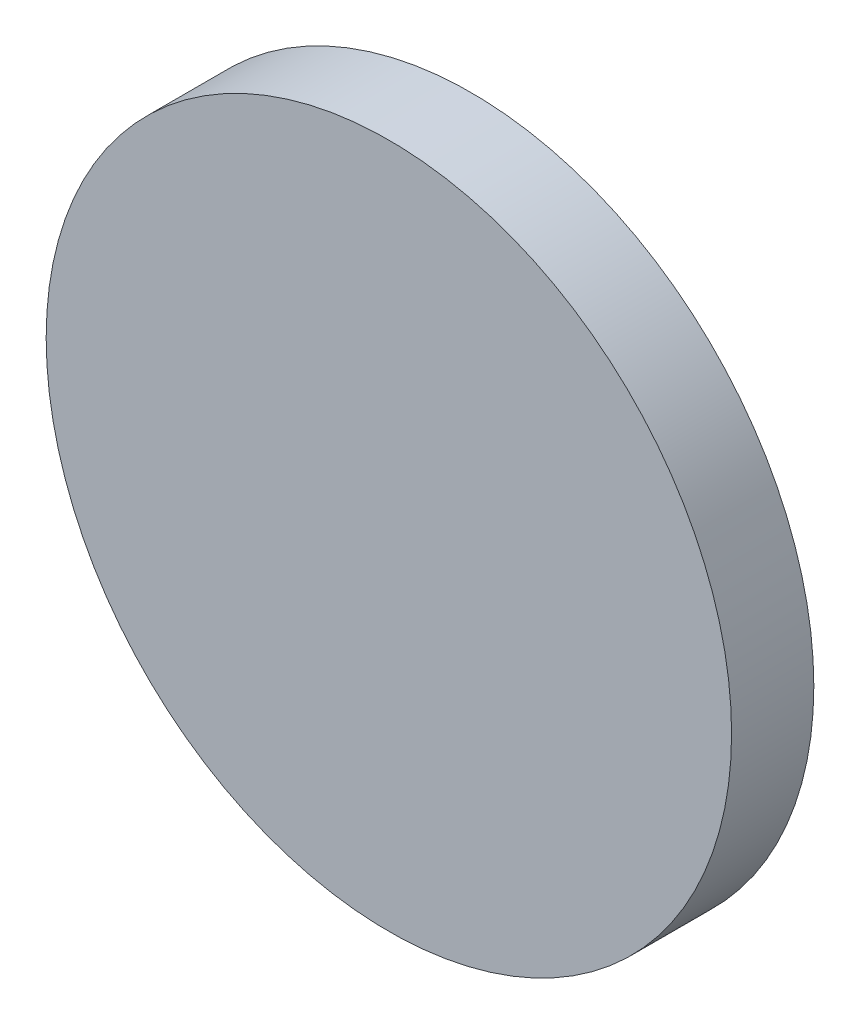
ISO-10303-21;
HEADER;
FILE_DESCRIPTION(('STEP AP214'),'2;1');
FILE_NAME('part.step','',(''),(''),'','','');
FILE_SCHEMA(('AUTOMOTIVE_DESIGN { 1 0 10303 214 1 1 1 1 }'));
ENDSEC;
DATA;
#1=APPLICATION_CONTEXT('core data for automotive mechanical design processes');
#2=APPLICATION_PROTOCOL_DEFINITION('international standard','automotive_design',2000,#1);
#3=PRODUCT_CONTEXT('',#1,'mechanical');
#4=PRODUCT('Part','Part','',(#3));
#5=PRODUCT_RELATED_PRODUCT_CATEGORY('part','',(#4));
#6=PRODUCT_DEFINITION_FORMATION('','',#4);
#7=PRODUCT_DEFINITION_CONTEXT('part definition',#1,'design');
#8=PRODUCT_DEFINITION('design','',#6,#7);
#9=PRODUCT_DEFINITION_SHAPE('','',#8);
#10=(LENGTH_UNIT() NAMED_UNIT(*) SI_UNIT(.MILLI.,.METRE.));
#11=(NAMED_UNIT(*) PLANE_ANGLE_UNIT() SI_UNIT($,.RADIAN.));
#12=(NAMED_UNIT(*) SI_UNIT($,.STERADIAN.) SOLID_ANGLE_UNIT());
#13=UNCERTAINTY_MEASURE_WITH_UNIT(LENGTH_MEASURE(1.E-05),#10,'distance_accuracy_value','');
#14=(GEOMETRIC_REPRESENTATION_CONTEXT(3) GLOBAL_UNCERTAINTY_ASSIGNED_CONTEXT((#13)) GLOBAL_UNIT_ASSIGNED_CONTEXT((#10,
#11,#12)) REPRESENTATION_CONTEXT('',''));
#15=CARTESIAN_POINT('',(0.,0.,0.));
#16=DIRECTION('',(0.,0.,1.));
#17=DIRECTION('',(1.,0.,0.));
#18=AXIS2_PLACEMENT_3D('',#15,#16,#17);
#19=CARTESIAN_POINT('',(0.,0.,1.5));
#20=DIRECTION('',(0.,0.,-1.));
#21=DIRECTION('',(-1.,0.,0.));
#22=AXIS2_PLACEMENT_3D('',#19,#20,#21);
#23=CYLINDRICAL_SURFACE('',#22,6.25);
#24=CARTESIAN_POINT('',(0.,0.,1.5));
#25=DIRECTION('',(0.,0.,1.));
#26=DIRECTION('',(1.,0.,0.));
#27=AXIS2_PLACEMENT_3D('',#24,#25,#26);
#28=CIRCLE('',#27,6.25);
#29=CARTESIAN_POINT('',(6.25,0.,1.5));
#30=VERTEX_POINT('',#29);
#31=EDGE_CURVE('E10',#30,#30,#28,.T.);
#32=ORIENTED_EDGE('',*,*,#31,.F.);
#33=EDGE_LOOP('',(#32));
#34=FACE_BOUND('',#33,.T.);
#35=CARTESIAN_POINT('',(0.,0.,0.));
#36=DIRECTION('',(0.,0.,1.));
#37=DIRECTION('',(1.,0.,0.));
#38=AXIS2_PLACEMENT_3D('',#35,#36,#37);
#39=CIRCLE('',#38,6.25);
#40=CARTESIAN_POINT('',(6.25,0.,0.));
#41=VERTEX_POINT('',#40);
#42=EDGE_CURVE('E36',#41,#41,#39,.T.);
#43=ORIENTED_EDGE('',*,*,#42,.T.);
#44=EDGE_LOOP('',(#43));
#45=FACE_BOUND('',#44,.T.);
#46=ADVANCED_FACE('F33',(#34,#45),#23,.T.);
#47=CARTESIAN_POINT('',(0.,0.,1.5));
#48=DIRECTION('',(0.,0.,1.));
#49=DIRECTION('',(1.,0.,0.));
#50=AXIS2_PLACEMENT_3D('',#47,#48,#49);
#51=PLANE('',#50);
#52=ORIENTED_EDGE('',*,*,#31,.T.);
#53=EDGE_LOOP('',(#52));
#54=FACE_BOUND('',#53,.T.);
#55=ADVANCED_FACE('F48',(#54),#51,.T.);
#56=CARTESIAN_POINT('',(0.,0.,0.));
#57=DIRECTION('',(0.,0.,1.));
#58=DIRECTION('',(1.,0.,0.));
#59=AXIS2_PLACEMENT_3D('',#56,#57,#58);
#60=PLANE('',#59);
#61=ORIENTED_EDGE('',*,*,#42,.F.);
#62=EDGE_LOOP('',(#61));
#63=FACE_BOUND('',#62,.T.);
#64=ADVANCED_FACE('F46',(#63),#60,.F.);
#65=CLOSED_SHELL('',(#46,#55,#64));
#66=MANIFOLD_SOLID_BREP('B2',#65);
#67=ADVANCED_BREP_SHAPE_REPRESENTATION('',(#18,#66),#14);
#68=SHAPE_DEFINITION_REPRESENTATION(#9,#67);
ENDSEC;
END-ISO-10303-21;
